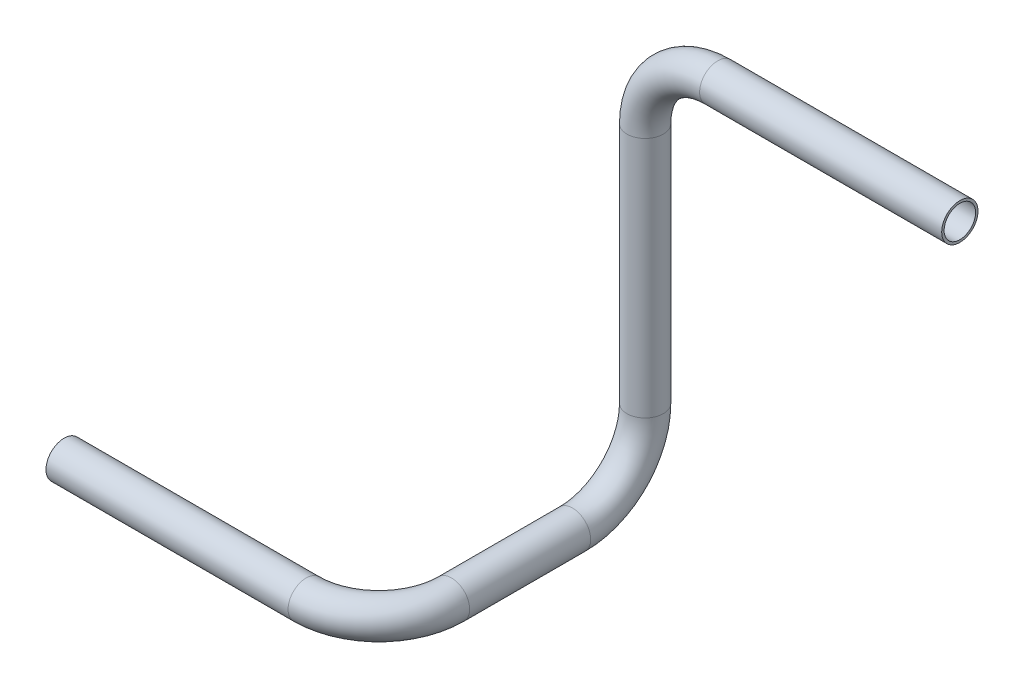
ISO-10303-21;
HEADER;
FILE_DESCRIPTION(('STEP AP214'),'2;1');
FILE_NAME('part.step','',(''),(''),'','','');
FILE_SCHEMA(('AUTOMOTIVE_DESIGN { 1 0 10303 214 1 1 1 1 }'));
ENDSEC;
DATA;
#1=APPLICATION_CONTEXT('core data for automotive mechanical design processes');
#2=APPLICATION_PROTOCOL_DEFINITION('international standard','automotive_design',2000,#1);
#3=PRODUCT_CONTEXT('',#1,'mechanical');
#4=PRODUCT('Part','Part','',(#3));
#5=PRODUCT_RELATED_PRODUCT_CATEGORY('part','',(#4));
#6=PRODUCT_DEFINITION_FORMATION('','',#4);
#7=PRODUCT_DEFINITION_CONTEXT('part definition',#1,'design');
#8=PRODUCT_DEFINITION('design','',#6,#7);
#9=PRODUCT_DEFINITION_SHAPE('','',#8);
#10=(LENGTH_UNIT() NAMED_UNIT(*) SI_UNIT(.MILLI.,.METRE.));
#11=(NAMED_UNIT(*) PLANE_ANGLE_UNIT() SI_UNIT($,.RADIAN.));
#12=(NAMED_UNIT(*) SI_UNIT($,.STERADIAN.) SOLID_ANGLE_UNIT());
#13=UNCERTAINTY_MEASURE_WITH_UNIT(LENGTH_MEASURE(1.E-05),#10,'distance_accuracy_value','');
#14=(GEOMETRIC_REPRESENTATION_CONTEXT(3) GLOBAL_UNCERTAINTY_ASSIGNED_CONTEXT((#13)) GLOBAL_UNIT_ASSIGNED_CONTEXT((#10,
#11,#12)) REPRESENTATION_CONTEXT('',''));
#15=CARTESIAN_POINT('',(0.,0.,0.));
#16=DIRECTION('',(0.,0.,1.));
#17=DIRECTION('',(1.,0.,0.));
#18=AXIS2_PLACEMENT_3D('',#15,#16,#17);
#19=CARTESIAN_POINT('',(0.,0.,0.));
#20=DIRECTION('',(-1.,0.,0.));
#21=DIRECTION('',(0.,1.,0.));
#22=AXIS2_PLACEMENT_3D('',#19,#20,#21);
#23=PLANE('',#22);
#24=CARTESIAN_POINT('',(0.,0.,0.));
#25=DIRECTION('',(-1.,0.,0.));
#26=DIRECTION('',(0.,0.,1.));
#27=AXIS2_PLACEMENT_3D('',#24,#25,#26);
#28=CIRCLE('',#27,13.);
#29=CARTESIAN_POINT('',(0.,0.,13.));
#30=VERTEX_POINT('',#29);
#31=EDGE_CURVE('E78',#30,#30,#28,.T.);
#32=ORIENTED_EDGE('',*,*,#31,.F.);
#33=EDGE_LOOP('',(#32));
#34=FACE_BOUND('',#33,.T.);
#35=CARTESIAN_POINT('',(0.,0.,0.));
#36=DIRECTION('',(-1.,0.,0.));
#37=DIRECTION('',(0.,1.,0.));
#38=AXIS2_PLACEMENT_3D('',#35,#36,#37);
#39=CIRCLE('',#38,15.);
#40=CARTESIAN_POINT('',(0.,15.,0.));
#41=VERTEX_POINT('',#40);
#42=EDGE_CURVE('E71',#41,#41,#39,.T.);
#43=ORIENTED_EDGE('',*,*,#42,.T.);
#44=EDGE_LOOP('',(#43));
#45=FACE_BOUND('',#44,.T.);
#46=ADVANCED_FACE('F43',(#34,#45),#23,.T.);
#47=CARTESIAN_POINT('',(520.,320.,-220.));
#48=DIRECTION('',(-1.,0.,0.));
#49=DIRECTION('',(0.,0.,1.));
#50=AXIS2_PLACEMENT_3D('',#47,#48,#49);
#51=PLANE('',#50);
#52=CARTESIAN_POINT('',(520.,320.,-220.));
#53=DIRECTION('',(-1.,0.,0.));
#54=DIRECTION('',(0.,0.,1.));
#55=AXIS2_PLACEMENT_3D('',#52,#53,#54);
#56=CIRCLE('',#55,13.);
#57=CARTESIAN_POINT('',(520.,320.,-207.));
#58=VERTEX_POINT('',#57);
#59=EDGE_CURVE('E74',#58,#58,#56,.T.);
#60=ORIENTED_EDGE('',*,*,#59,.T.);
#61=EDGE_LOOP('',(#60));
#62=FACE_BOUND('',#61,.T.);
#63=CARTESIAN_POINT('',(520.,320.,-220.));
#64=DIRECTION('',(-1.,0.,0.));
#65=DIRECTION('',(0.,0.,1.));
#66=AXIS2_PLACEMENT_3D('',#63,#64,#65);
#67=CIRCLE('',#66,15.);
#68=CARTESIAN_POINT('',(520.,320.,-205.));
#69=VERTEX_POINT('',#68);
#70=EDGE_CURVE('E11',#69,#69,#67,.T.);
#71=ORIENTED_EDGE('',*,*,#70,.F.);
#72=EDGE_LOOP('',(#71));
#73=FACE_BOUND('',#72,.T.);
#74=ADVANCED_FACE('F110',(#62,#73),#51,.F.);
#75=CARTESIAN_POINT('',(0.,0.,0.));
#76=DIRECTION('',(1.,0.,0.));
#77=DIRECTION('',(0.,0.,-1.));
#78=AXIS2_PLACEMENT_3D('',#75,#76,#77);
#79=CYLINDRICAL_SURFACE('',#78,15.);
#80=CARTESIAN_POINT('',(200.,0.,0.));
#81=DIRECTION('',(-1.,0.,0.));
#82=DIRECTION('',(0.,1.,0.));
#83=AXIS2_PLACEMENT_3D('',#80,#81,#82);
#84=CIRCLE('',#83,15.);
#85=CARTESIAN_POINT('',(200.,0.,15.));
#86=VERTEX_POINT('',#85);
#87=EDGE_CURVE('E68',#86,#86,#84,.T.);
#88=ORIENTED_EDGE('',*,*,#87,.T.);
#89=EDGE_LOOP('',(#88));
#90=FACE_BOUND('',#89,.T.);
#91=ORIENTED_EDGE('',*,*,#42,.F.);
#92=EDGE_LOOP('',(#91));
#93=FACE_BOUND('',#92,.T.);
#94=ADVANCED_FACE('F114',(#90,#93),#79,.T.);
#95=CARTESIAN_POINT('',(200.,0.,-60.));
#96=DIRECTION('',(0.,1.,0.));
#97=DIRECTION('',(0.,0.,1.));
#98=AXIS2_PLACEMENT_3D('',#95,#96,#97);
#99=TOROIDAL_SURFACE('',#98,60.,15.);
#100=CARTESIAN_POINT('',(260.,0.,-60.));
#101=DIRECTION('',(0.,0.,1.));
#102=DIRECTION('',(0.,1.,0.));
#103=AXIS2_PLACEMENT_3D('',#100,#101,#102);
#104=CIRCLE('',#103,15.);
#105=CARTESIAN_POINT('',(275.,0.,-60.));
#106=VERTEX_POINT('',#105);
#107=EDGE_CURVE('E65',#106,#106,#104,.T.);
#108=CARTESIAN_POINT('',(200.,0.,-60.));
#109=DIRECTION('',(0.,1.,0.));
#110=DIRECTION('',(0.,0.,1.));
#111=AXIS2_PLACEMENT_3D('',#108,#109,#110);
#112=CIRCLE('',#111,75.);
#113=EDGE_CURVE('',#86,#106,#112,.T.);
#114=ORIENTED_EDGE('',*,*,#87,.F.);
#115=ORIENTED_EDGE('',*,*,#107,.T.);
#116=ORIENTED_EDGE('',*,*,#113,.T.);
#117=ORIENTED_EDGE('',*,*,#113,.F.);
#118=EDGE_LOOP('',(#114,#116,#115,#117));
#119=FACE_BOUND('',#118,.T.);
#120=ADVANCED_FACE('F116',(#119),#99,.T.);
#121=CARTESIAN_POINT('',(260.,0.,-60.));
#122=DIRECTION('',(0.,0.,-1.));
#123=DIRECTION('',(-1.,0.,0.));
#124=AXIS2_PLACEMENT_3D('',#121,#122,#123);
#125=CYLINDRICAL_SURFACE('',#124,15.);
#126=CARTESIAN_POINT('',(260.,0.,-160.));
#127=DIRECTION('',(0.,0.,1.));
#128=DIRECTION('',(0.,1.,0.));
#129=AXIS2_PLACEMENT_3D('',#126,#127,#128);
#130=CIRCLE('',#129,15.);
#131=CARTESIAN_POINT('',(260.,-15.,-160.));
#132=VERTEX_POINT('',#131);
#133=EDGE_CURVE('E62',#132,#132,#130,.T.);
#134=ORIENTED_EDGE('',*,*,#133,.T.);
#135=EDGE_LOOP('',(#134));
#136=FACE_BOUND('',#135,.T.);
#137=ORIENTED_EDGE('',*,*,#107,.F.);
#138=EDGE_LOOP('',(#137));
#139=FACE_BOUND('',#138,.T.);
#140=ADVANCED_FACE('F123',(#136,#139),#125,.T.);
#141=CARTESIAN_POINT('',(260.,60.,-160.));
#142=DIRECTION('',(1.,0.,0.));
#143=DIRECTION('',(0.,0.,-1.));
#144=AXIS2_PLACEMENT_3D('',#141,#142,#143);
#145=TOROIDAL_SURFACE('',#144,60.,15.);
#146=CARTESIAN_POINT('',(260.,60.,-220.));
#147=DIRECTION('',(0.,-1.,0.));
#148=DIRECTION('',(0.,0.,1.));
#149=AXIS2_PLACEMENT_3D('',#146,#147,#148);
#150=CIRCLE('',#149,15.);
#151=CARTESIAN_POINT('',(260.,60.,-235.));
#152=VERTEX_POINT('',#151);
#153=EDGE_CURVE('E57',#152,#152,#150,.T.);
#154=CARTESIAN_POINT('',(260.,60.,-160.));
#155=DIRECTION('',(1.,0.,0.));
#156=DIRECTION('',(0.,0.,-1.));
#157=AXIS2_PLACEMENT_3D('',#154,#155,#156);
#158=CIRCLE('',#157,75.);
#159=EDGE_CURVE('',#132,#152,#158,.T.);
#160=ORIENTED_EDGE('',*,*,#133,.F.);
#161=ORIENTED_EDGE('',*,*,#153,.T.);
#162=ORIENTED_EDGE('',*,*,#159,.T.);
#163=ORIENTED_EDGE('',*,*,#159,.F.);
#164=EDGE_LOOP('',(#160,#162,#161,#163));
#165=FACE_BOUND('',#164,.T.);
#166=ADVANCED_FACE('F140',(#165),#145,.T.);
#167=CARTESIAN_POINT('',(260.,60.,-220.));
#168=DIRECTION('',(0.,1.,0.));
#169=DIRECTION('',(0.,0.,1.));
#170=AXIS2_PLACEMENT_3D('',#167,#168,#169);
#171=CYLINDRICAL_SURFACE('',#170,15.);
#172=CARTESIAN_POINT('',(260.,260.,-220.));
#173=DIRECTION('',(0.,-1.,0.));
#174=DIRECTION('',(0.,0.,1.));
#175=AXIS2_PLACEMENT_3D('',#172,#173,#174);
#176=CIRCLE('',#175,15.);
#177=CARTESIAN_POINT('',(245.,260.,-220.));
#178=VERTEX_POINT('',#177);
#179=EDGE_CURVE('E53',#178,#178,#176,.T.);
#180=ORIENTED_EDGE('',*,*,#179,.T.);
#181=EDGE_LOOP('',(#180));
#182=FACE_BOUND('',#181,.T.);
#183=ORIENTED_EDGE('',*,*,#153,.F.);
#184=EDGE_LOOP('',(#183));
#185=FACE_BOUND('',#184,.T.);
#186=ADVANCED_FACE('F134',(#182,#185),#171,.T.);
#187=CARTESIAN_POINT('',(320.,260.,-220.));
#188=DIRECTION('',(0.,0.,-1.));
#189=DIRECTION('',(-1.,0.,0.));
#190=AXIS2_PLACEMENT_3D('',#187,#188,#189);
#191=TOROIDAL_SURFACE('',#190,60.,15.);
#192=CARTESIAN_POINT('',(320.,320.,-220.));
#193=DIRECTION('',(-1.,0.,0.));
#194=DIRECTION('',(0.,0.,1.));
#195=AXIS2_PLACEMENT_3D('',#192,#193,#194);
#196=CIRCLE('',#195,15.);
#197=CARTESIAN_POINT('',(320.,335.,-220.));
#198=VERTEX_POINT('',#197);
#199=EDGE_CURVE('E49',#198,#198,#196,.T.);
#200=CARTESIAN_POINT('',(320.,260.,-220.));
#201=DIRECTION('',(0.,0.,-1.));
#202=DIRECTION('',(-1.,0.,0.));
#203=AXIS2_PLACEMENT_3D('',#200,#201,#202);
#204=CIRCLE('',#203,75.);
#205=EDGE_CURVE('',#178,#198,#204,.T.);
#206=ORIENTED_EDGE('',*,*,#179,.F.);
#207=ORIENTED_EDGE('',*,*,#199,.T.);
#208=ORIENTED_EDGE('',*,*,#205,.T.);
#209=ORIENTED_EDGE('',*,*,#205,.F.);
#210=EDGE_LOOP('',(#206,#208,#207,#209));
#211=FACE_BOUND('',#210,.T.);
#212=ADVANCED_FACE('F129',(#211),#191,.T.);
#213=CARTESIAN_POINT('',(320.,320.,-220.));
#214=DIRECTION('',(1.,0.,0.));
#215=DIRECTION('',(0.,0.,-1.));
#216=AXIS2_PLACEMENT_3D('',#213,#214,#215);
#217=CYLINDRICAL_SURFACE('',#216,15.);
#218=ORIENTED_EDGE('',*,*,#70,.T.);
#219=EDGE_LOOP('',(#218));
#220=FACE_BOUND('',#219,.T.);
#221=ORIENTED_EDGE('',*,*,#199,.F.);
#222=EDGE_LOOP('',(#221));
#223=FACE_BOUND('',#222,.T.);
#224=ADVANCED_FACE('F104',(#220,#223),#217,.T.);
#225=CARTESIAN_POINT('',(0.,0.,0.));
#226=DIRECTION('',(1.,0.,0.));
#227=DIRECTION('',(0.,0.,-1.));
#228=AXIS2_PLACEMENT_3D('',#225,#226,#227);
#229=CYLINDRICAL_SURFACE('',#228,13.);
#230=CARTESIAN_POINT('',(200.,0.,0.));
#231=DIRECTION('',(1.,0.,0.));
#232=DIRECTION('',(0.,0.,-1.));
#233=AXIS2_PLACEMENT_3D('',#230,#231,#232);
#234=CIRCLE('',#233,13.);
#235=CARTESIAN_POINT('',(200.,0.,13.));
#236=VERTEX_POINT('',#235);
#237=EDGE_CURVE('E81',#236,#236,#234,.F.);
#238=ORIENTED_EDGE('',*,*,#237,.F.);
#239=EDGE_LOOP('',(#238));
#240=FACE_BOUND('',#239,.T.);
#241=ORIENTED_EDGE('',*,*,#31,.T.);
#242=EDGE_LOOP('',(#241));
#243=FACE_BOUND('',#242,.T.);
#244=ADVANCED_FACE('F101',(#240,#243),#229,.F.);
#245=CARTESIAN_POINT('',(200.,0.,-60.));
#246=DIRECTION('',(0.,1.,0.));
#247=DIRECTION('',(0.,0.,1.));
#248=AXIS2_PLACEMENT_3D('',#245,#246,#247);
#249=TOROIDAL_SURFACE('',#248,60.,13.);
#250=CARTESIAN_POINT('',(260.,0.,-60.));
#251=DIRECTION('',(0.,0.,1.));
#252=DIRECTION('',(1.,0.,0.));
#253=AXIS2_PLACEMENT_3D('',#250,#251,#252);
#254=CIRCLE('',#253,13.);
#255=CARTESIAN_POINT('',(273.,0.,-60.));
#256=VERTEX_POINT('',#255);
#257=EDGE_CURVE('E93',#256,#256,#254,.T.);
#258=CARTESIAN_POINT('',(200.,0.,-60.));
#259=DIRECTION('',(0.,1.,0.));
#260=DIRECTION('',(0.,0.,1.));
#261=AXIS2_PLACEMENT_3D('',#258,#259,#260);
#262=CIRCLE('',#261,73.);
#263=EDGE_CURVE('',#236,#256,#262,.T.);
#264=ORIENTED_EDGE('',*,*,#237,.T.);
#265=ORIENTED_EDGE('',*,*,#257,.F.);
#266=ORIENTED_EDGE('',*,*,#263,.T.);
#267=ORIENTED_EDGE('',*,*,#263,.F.);
#268=EDGE_LOOP('',(#264,#266,#265,#267));
#269=FACE_BOUND('',#268,.T.);
#270=ADVANCED_FACE('F99',(#269),#249,.F.);
#271=CARTESIAN_POINT('',(260.,0.,-60.));
#272=DIRECTION('',(0.,0.,-1.));
#273=DIRECTION('',(-1.,0.,0.));
#274=AXIS2_PLACEMENT_3D('',#271,#272,#273);
#275=CYLINDRICAL_SURFACE('',#274,13.);
#276=CARTESIAN_POINT('',(260.,0.,-160.));
#277=DIRECTION('',(0.,0.,-1.));
#278=DIRECTION('',(-1.,0.,0.));
#279=AXIS2_PLACEMENT_3D('',#276,#277,#278);
#280=CIRCLE('',#279,13.);
#281=CARTESIAN_POINT('',(260.,-13.,-160.));
#282=VERTEX_POINT('',#281);
#283=EDGE_CURVE('E90',#282,#282,#280,.F.);
#284=ORIENTED_EDGE('',*,*,#283,.F.);
#285=EDGE_LOOP('',(#284));
#286=FACE_BOUND('',#285,.T.);
#287=ORIENTED_EDGE('',*,*,#257,.T.);
#288=EDGE_LOOP('',(#287));
#289=FACE_BOUND('',#288,.T.);
#290=ADVANCED_FACE('F188',(#286,#289),#275,.F.);
#291=CARTESIAN_POINT('',(260.,60.,-160.));
#292=DIRECTION('',(1.,0.,0.));
#293=DIRECTION('',(0.,0.,-1.));
#294=AXIS2_PLACEMENT_3D('',#291,#292,#293);
#295=TOROIDAL_SURFACE('',#294,60.,13.);
#296=CARTESIAN_POINT('',(260.,60.,-220.));
#297=DIRECTION('',(0.,-1.,0.));
#298=DIRECTION('',(0.,0.,-1.));
#299=AXIS2_PLACEMENT_3D('',#296,#297,#298);
#300=CIRCLE('',#299,13.);
#301=CARTESIAN_POINT('',(260.,60.,-233.));
#302=VERTEX_POINT('',#301);
#303=EDGE_CURVE('E87',#302,#302,#300,.T.);
#304=CARTESIAN_POINT('',(260.,60.,-160.));
#305=DIRECTION('',(1.,0.,0.));
#306=DIRECTION('',(0.,0.,-1.));
#307=AXIS2_PLACEMENT_3D('',#304,#305,#306);
#308=CIRCLE('',#307,73.);
#309=EDGE_CURVE('',#282,#302,#308,.T.);
#310=ORIENTED_EDGE('',*,*,#283,.T.);
#311=ORIENTED_EDGE('',*,*,#303,.F.);
#312=ORIENTED_EDGE('',*,*,#309,.T.);
#313=ORIENTED_EDGE('',*,*,#309,.F.);
#314=EDGE_LOOP('',(#310,#312,#311,#313));
#315=FACE_BOUND('',#314,.T.);
#316=ADVANCED_FACE('F198',(#315),#295,.F.);
#317=CARTESIAN_POINT('',(260.,60.,-220.));
#318=DIRECTION('',(0.,1.,0.));
#319=DIRECTION('',(0.,0.,1.));
#320=AXIS2_PLACEMENT_3D('',#317,#318,#319);
#321=CYLINDRICAL_SURFACE('',#320,13.);
#322=CARTESIAN_POINT('',(260.,260.,-220.));
#323=DIRECTION('',(0.,1.,0.));
#324=DIRECTION('',(0.,0.,1.));
#325=AXIS2_PLACEMENT_3D('',#322,#323,#324);
#326=CIRCLE('',#325,13.);
#327=CARTESIAN_POINT('',(247.,260.,-220.));
#328=VERTEX_POINT('',#327);
#329=EDGE_CURVE('E84',#328,#328,#326,.F.);
#330=ORIENTED_EDGE('',*,*,#329,.F.);
#331=EDGE_LOOP('',(#330));
#332=FACE_BOUND('',#331,.T.);
#333=ORIENTED_EDGE('',*,*,#303,.T.);
#334=EDGE_LOOP('',(#333));
#335=FACE_BOUND('',#334,.T.);
#336=ADVANCED_FACE('F208',(#332,#335),#321,.F.);
#337=CARTESIAN_POINT('',(320.,260.,-220.));
#338=DIRECTION('',(0.,0.,-1.));
#339=DIRECTION('',(-1.,0.,0.));
#340=AXIS2_PLACEMENT_3D('',#337,#338,#339);
#341=TOROIDAL_SURFACE('',#340,60.,13.);
#342=CARTESIAN_POINT('',(320.,320.,-220.));
#343=DIRECTION('',(-1.,0.,0.));
#344=DIRECTION('',(0.,-1.,0.));
#345=AXIS2_PLACEMENT_3D('',#342,#343,#344);
#346=CIRCLE('',#345,13.);
#347=CARTESIAN_POINT('',(320.,333.,-220.));
#348=VERTEX_POINT('',#347);
#349=EDGE_CURVE('E77',#348,#348,#346,.T.);
#350=CARTESIAN_POINT('',(320.,260.,-220.));
#351=DIRECTION('',(0.,0.,-1.));
#352=DIRECTION('',(-1.,0.,0.));
#353=AXIS2_PLACEMENT_3D('',#350,#351,#352);
#354=CIRCLE('',#353,73.);
#355=EDGE_CURVE('',#328,#348,#354,.T.);
#356=ORIENTED_EDGE('',*,*,#329,.T.);
#357=ORIENTED_EDGE('',*,*,#349,.F.);
#358=ORIENTED_EDGE('',*,*,#355,.T.);
#359=ORIENTED_EDGE('',*,*,#355,.F.);
#360=EDGE_LOOP('',(#356,#358,#357,#359));
#361=FACE_BOUND('',#360,.T.);
#362=ADVANCED_FACE('F218',(#361),#341,.F.);
#363=CARTESIAN_POINT('',(320.,320.,-220.));
#364=DIRECTION('',(1.,0.,0.));
#365=DIRECTION('',(0.,0.,-1.));
#366=AXIS2_PLACEMENT_3D('',#363,#364,#365);
#367=CYLINDRICAL_SURFACE('',#366,13.);
#368=ORIENTED_EDGE('',*,*,#59,.F.);
#369=EDGE_LOOP('',(#368));
#370=FACE_BOUND('',#369,.T.);
#371=ORIENTED_EDGE('',*,*,#349,.T.);
#372=EDGE_LOOP('',(#371));
#373=FACE_BOUND('',#372,.T.);
#374=ADVANCED_FACE('F111',(#370,#373),#367,.F.);
#375=CLOSED_SHELL('',(#46,#74,#94,#120,#140,#166,#186,#212,#224,#244,#270,#290,#316,#336,#362,#374));
#376=MANIFOLD_SOLID_BREP('B2',#375);
#377=ADVANCED_BREP_SHAPE_REPRESENTATION('',(#18,#376),#14);
#378=SHAPE_DEFINITION_REPRESENTATION(#9,#377);
ENDSEC;
END-ISO-10303-21;
